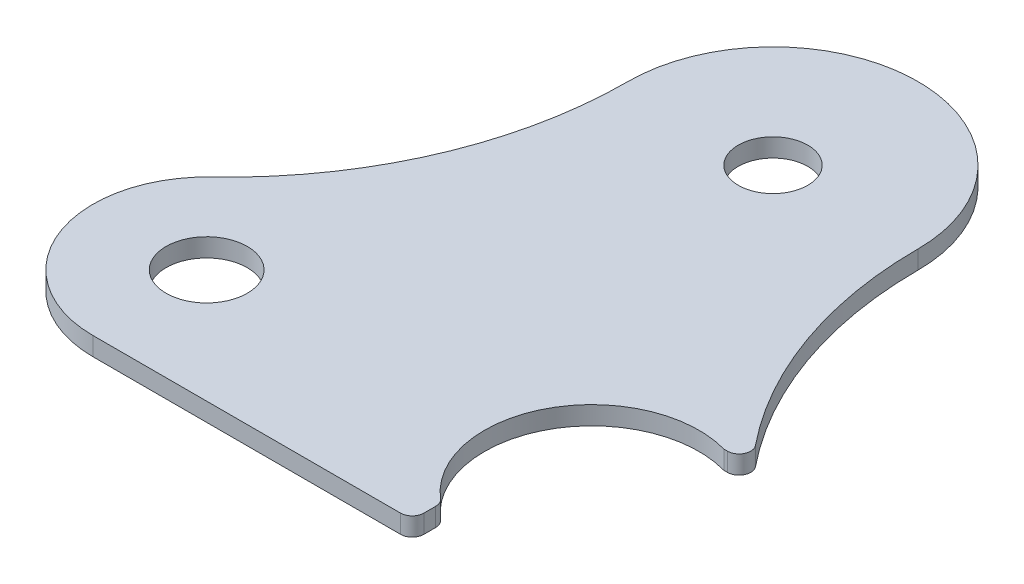
ISO-10303-21;
HEADER;
FILE_DESCRIPTION(('STEP AP214'),'2;1');
FILE_NAME('part.step','',(''),(''),'','','');
FILE_SCHEMA(('AUTOMOTIVE_DESIGN { 1 0 10303 214 1 1 1 1 }'));
ENDSEC;
DATA;
#1=APPLICATION_CONTEXT('core data for automotive mechanical design processes');
#2=APPLICATION_PROTOCOL_DEFINITION('international standard','automotive_design',2000,#1);
#3=PRODUCT_CONTEXT('',#1,'mechanical');
#4=PRODUCT('Part','Part','',(#3));
#5=PRODUCT_RELATED_PRODUCT_CATEGORY('part','',(#4));
#6=PRODUCT_DEFINITION_FORMATION('','',#4);
#7=PRODUCT_DEFINITION_CONTEXT('part definition',#1,'design');
#8=PRODUCT_DEFINITION('design','',#6,#7);
#9=PRODUCT_DEFINITION_SHAPE('','',#8);
#10=(LENGTH_UNIT() NAMED_UNIT(*) SI_UNIT(.MILLI.,.METRE.));
#11=(NAMED_UNIT(*) PLANE_ANGLE_UNIT() SI_UNIT($,.RADIAN.));
#12=(NAMED_UNIT(*) SI_UNIT($,.STERADIAN.) SOLID_ANGLE_UNIT());
#13=UNCERTAINTY_MEASURE_WITH_UNIT(LENGTH_MEASURE(1.E-05),#10,'distance_accuracy_value','');
#14=(GEOMETRIC_REPRESENTATION_CONTEXT(3) GLOBAL_UNCERTAINTY_ASSIGNED_CONTEXT((#13)) GLOBAL_UNIT_ASSIGNED_CONTEXT((#10,
#11,#12)) REPRESENTATION_CONTEXT('',''));
#15=CARTESIAN_POINT('',(0.,0.,0.));
#16=DIRECTION('',(0.,0.,1.));
#17=DIRECTION('',(1.,0.,0.));
#18=AXIS2_PLACEMENT_3D('',#15,#16,#17);
#19=CARTESIAN_POINT('',(0.,29.675,46.6220157262903));
#20=DIRECTION('',(0.,0.,-1.));
#21=DIRECTION('',(-1.,0.,0.));
#22=AXIS2_PLACEMENT_3D('',#19,#20,#21);
#23=PLANE('',#22);
#24=DIRECTION('',(1.,0.,0.));
#25=VECTOR('',#24,1.);
#26=CARTESIAN_POINT('',(0.,26.5,46.6220157262903));
#27=LINE('',#26,#25);
#28=CARTESIAN_POINT('',(38.1409489712363,26.5,46.6220157262903));
#29=VERTEX_POINT('',#28);
#30=CARTESIAN_POINT('',(38.7801844461986,26.5,46.6220157262903));
#31=VERTEX_POINT('',#30);
#32=EDGE_CURVE('E163',#29,#31,#27,.T.);
#33=ORIENTED_EDGE('',*,*,#32,.T.);
#34=DIRECTION('',(0.,-1.,0.));
#35=VECTOR('',#34,1.);
#36=CARTESIAN_POINT('',(38.7801844461986,29.675,46.6220157262903));
#37=LINE('',#36,#35);
#38=CARTESIAN_POINT('',(38.7801844461986,29.675,46.6220157262903));
#39=VERTEX_POINT('',#38);
#40=EDGE_CURVE('E11',#39,#31,#37,.T.);
#41=ORIENTED_EDGE('',*,*,#40,.F.);
#42=DIRECTION('',(1.,0.,0.));
#43=VECTOR('',#42,1.);
#44=CARTESIAN_POINT('',(0.,29.675,46.6220157262903));
#45=LINE('',#44,#43);
#46=CARTESIAN_POINT('',(38.1409489712363,29.675,46.6220157262903));
#47=VERTEX_POINT('',#46);
#48=EDGE_CURVE('E228',#47,#39,#45,.T.);
#49=ORIENTED_EDGE('',*,*,#48,.F.);
#50=DIRECTION('',(0.,-1.,0.));
#51=VECTOR('',#50,1.);
#52=CARTESIAN_POINT('',(38.1409489712363,29.675,46.6220157262903));
#53=LINE('',#52,#51);
#54=EDGE_CURVE('E58',#47,#29,#53,.T.);
#55=ORIENTED_EDGE('',*,*,#54,.T.);
#56=EDGE_LOOP('',(#33,#41,#49,#55));
#57=FACE_BOUND('',#56,.T.);
#58=ADVANCED_FACE('F41',(#57),#23,.F.);
#59=CARTESIAN_POINT('',(38.7801844461986,29.675,44.6220157262903));
#60=DIRECTION('',(0.,-1.,0.));
#61=DIRECTION('',(0.,0.,-1.));
#62=AXIS2_PLACEMENT_3D('',#59,#60,#61);
#63=CYLINDRICAL_SURFACE('',#62,2.);
#64=CARTESIAN_POINT('',(38.7801844461986,26.5,44.6220157262903));
#65=DIRECTION('',(0.,1.,0.));
#66=DIRECTION('',(0.,0.,1.));
#67=AXIS2_PLACEMENT_3D('',#64,#65,#66);
#68=CIRCLE('',#67,2.);
#69=CARTESIAN_POINT('',(40.3355436881448,26.5,43.3646941172767));
#70=VERTEX_POINT('',#69);
#71=EDGE_CURVE('E165',#31,#70,#68,.T.);
#72=ORIENTED_EDGE('',*,*,#71,.T.);
#73=DIRECTION('',(0.,-1.,0.));
#74=VECTOR('',#73,1.);
#75=CARTESIAN_POINT('',(40.3355436881448,29.675,43.3646941172767));
#76=LINE('',#75,#74);
#77=CARTESIAN_POINT('',(40.3355436881448,29.675,43.3646941172767));
#78=VERTEX_POINT('',#77);
#79=EDGE_CURVE('E50',#78,#70,#76,.T.);
#80=ORIENTED_EDGE('',*,*,#79,.F.);
#81=CARTESIAN_POINT('',(38.7801844461986,29.675,44.6220157262903));
#82=DIRECTION('',(0.,1.,0.));
#83=DIRECTION('',(0.,0.,1.));
#84=AXIS2_PLACEMENT_3D('',#81,#82,#83);
#85=CIRCLE('',#84,2.);
#86=EDGE_CURVE('E106',#39,#78,#85,.T.);
#87=ORIENTED_EDGE('',*,*,#86,.F.);
#88=ORIENTED_EDGE('',*,*,#40,.T.);
#89=EDGE_LOOP('',(#72,#80,#87,#88));
#90=FACE_BOUND('',#89,.T.);
#91=ADVANCED_FACE('F211',(#90),#63,.T.);
#92=CARTESIAN_POINT('',(93.9794779734972,29.675,0.));
#93=DIRECTION('',(0.,-1.,0.));
#94=DIRECTION('',(0.,0.,-1.));
#95=AXIS2_PLACEMENT_3D('',#92,#93,#94);
#96=CYLINDRICAL_SURFACE('',#95,68.9794779734972);
#97=CARTESIAN_POINT('',(93.9794779734972,26.5,0.));
#98=DIRECTION('',(0.,1.,0.));
#99=DIRECTION('',(0.,0.,1.));
#100=AXIS2_PLACEMENT_3D('',#97,#98,#99);
#101=CIRCLE('',#100,68.9794779734972);
#102=CARTESIAN_POINT('',(25.,26.5,0.));
#103=VERTEX_POINT('',#102);
#104=EDGE_CURVE('E168',#103,#70,#101,.T.);
#105=ORIENTED_EDGE('',*,*,#104,.F.);
#106=DIRECTION('',(0.,-1.,0.));
#107=VECTOR('',#106,1.);
#108=CARTESIAN_POINT('',(25.,29.675,0.));
#109=LINE('',#108,#107);
#110=CARTESIAN_POINT('',(25.,29.675,0.));
#111=VERTEX_POINT('',#110);
#112=EDGE_CURVE('E204',#111,#103,#109,.T.);
#113=ORIENTED_EDGE('',*,*,#112,.F.);
#114=CARTESIAN_POINT('',(93.9794779734972,29.675,0.));
#115=DIRECTION('',(0.,1.,0.));
#116=DIRECTION('',(0.,0.,1.));
#117=AXIS2_PLACEMENT_3D('',#114,#115,#116);
#118=CIRCLE('',#117,68.9794779734972);
#119=EDGE_CURVE('E210',#111,#78,#118,.T.);
#120=ORIENTED_EDGE('',*,*,#119,.T.);
#121=ORIENTED_EDGE('',*,*,#79,.T.);
#122=EDGE_LOOP('',(#105,#113,#120,#121));
#123=FACE_BOUND('',#122,.T.);
#124=ADVANCED_FACE('F208',(#123),#96,.F.);
#125=CARTESIAN_POINT('',(0.,29.675,0.));
#126=DIRECTION('',(0.,-1.,0.));
#127=DIRECTION('',(0.,0.,-1.));
#128=AXIS2_PLACEMENT_3D('',#125,#126,#127);
#129=CYLINDRICAL_SURFACE('',#128,25.);
#130=CARTESIAN_POINT('',(0.,26.5,0.));
#131=DIRECTION('',(0.,1.,0.));
#132=DIRECTION('',(0.,0.,1.));
#133=AXIS2_PLACEMENT_3D('',#130,#131,#132);
#134=CIRCLE('',#133,25.);
#135=CARTESIAN_POINT('',(-25.,26.5,0.));
#136=VERTEX_POINT('',#135);
#137=EDGE_CURVE('E171',#103,#136,#134,.T.);
#138=ORIENTED_EDGE('',*,*,#137,.T.);
#139=DIRECTION('',(0.,-1.,0.));
#140=VECTOR('',#139,1.);
#141=CARTESIAN_POINT('',(-25.,29.675,0.));
#142=LINE('',#141,#140);
#143=CARTESIAN_POINT('',(-25.,29.675,0.));
#144=VERTEX_POINT('',#143);
#145=EDGE_CURVE('E202',#144,#136,#142,.T.);
#146=ORIENTED_EDGE('',*,*,#145,.F.);
#147=CARTESIAN_POINT('',(0.,29.675,0.));
#148=DIRECTION('',(0.,1.,0.));
#149=DIRECTION('',(0.,0.,1.));
#150=AXIS2_PLACEMENT_3D('',#147,#148,#149);
#151=CIRCLE('',#150,25.);
#152=EDGE_CURVE('E223',#111,#144,#151,.T.);
#153=ORIENTED_EDGE('',*,*,#152,.F.);
#154=ORIENTED_EDGE('',*,*,#112,.T.);
#155=EDGE_LOOP('',(#138,#146,#153,#154));
#156=FACE_BOUND('',#155,.T.);
#157=ADVANCED_FACE('F220',(#156),#129,.T.);
#158=CARTESIAN_POINT('',(-93.9794779734972,29.675,0.));
#159=DIRECTION('',(0.,-1.,0.));
#160=DIRECTION('',(0.,0.,-1.));
#161=AXIS2_PLACEMENT_3D('',#158,#159,#160);
#162=CYLINDRICAL_SURFACE('',#161,68.9794779734972);
#163=CARTESIAN_POINT('',(-93.9794779734972,26.5,0.));
#164=DIRECTION('',(0.,1.,0.));
#165=DIRECTION('',(0.,0.,1.));
#166=AXIS2_PLACEMENT_3D('',#163,#164,#165);
#167=CIRCLE('',#166,68.9794779734972);
#168=CARTESIAN_POINT('',(-46.6535840387571,26.5,50.1839430971094));
#169=VERTEX_POINT('',#168);
#170=EDGE_CURVE('E174',#169,#136,#167,.T.);
#171=ORIENTED_EDGE('',*,*,#170,.F.);
#172=DIRECTION('',(0.,-1.,0.));
#173=VECTOR('',#172,1.);
#174=CARTESIAN_POINT('',(-46.6535840387571,29.675,50.1839430971094));
#175=LINE('',#174,#173);
#176=CARTESIAN_POINT('',(-46.6535840387571,29.675,50.1839430971094));
#177=VERTEX_POINT('',#176);
#178=EDGE_CURVE('E200',#177,#169,#175,.T.);
#179=ORIENTED_EDGE('',*,*,#178,.F.);
#180=CARTESIAN_POINT('',(-93.9794779734972,29.675,0.));
#181=DIRECTION('',(0.,1.,0.));
#182=DIRECTION('',(0.,0.,1.));
#183=AXIS2_PLACEMENT_3D('',#180,#181,#182);
#184=CIRCLE('',#183,68.9794779734972);
#185=EDGE_CURVE('E225',#177,#144,#184,.T.);
#186=ORIENTED_EDGE('',*,*,#185,.T.);
#187=ORIENTED_EDGE('',*,*,#145,.T.);
#188=EDGE_LOOP('',(#171,#179,#186,#187));
#189=FACE_BOUND('',#188,.T.);
#190=ADVANCED_FACE('F340',(#189),#162,.F.);
#191=CARTESIAN_POINT('',(-33.2,29.675,64.45));
#192=DIRECTION('',(0.,-1.,0.));
#193=DIRECTION('',(0.,0.,-1.));
#194=AXIS2_PLACEMENT_3D('',#191,#192,#193);
#195=CYLINDRICAL_SURFACE('',#194,19.6091637517874);
#196=CARTESIAN_POINT('',(-33.2,26.5,64.45));
#197=DIRECTION('',(0.,1.,0.));
#198=DIRECTION('',(0.,0.,1.));
#199=AXIS2_PLACEMENT_3D('',#196,#197,#198);
#200=CIRCLE('',#199,19.6091637517874);
#201=CARTESIAN_POINT('',(-33.2,26.5,84.0591637517874));
#202=VERTEX_POINT('',#201);
#203=EDGE_CURVE('E177',#169,#202,#200,.T.);
#204=ORIENTED_EDGE('',*,*,#203,.T.);
#205=DIRECTION('',(0.,-1.,0.));
#206=VECTOR('',#205,1.);
#207=CARTESIAN_POINT('',(-33.2,29.675,84.0591637517874));
#208=LINE('',#207,#206);
#209=CARTESIAN_POINT('',(-33.2,29.675,84.0591637517874));
#210=VERTEX_POINT('',#209);
#211=EDGE_CURVE('E198',#210,#202,#208,.T.);
#212=ORIENTED_EDGE('',*,*,#211,.F.);
#213=CARTESIAN_POINT('',(-33.2,29.675,64.45));
#214=DIRECTION('',(0.,1.,0.));
#215=DIRECTION('',(0.,0.,1.));
#216=AXIS2_PLACEMENT_3D('',#213,#214,#215);
#217=CIRCLE('',#216,19.6091637517874);
#218=EDGE_CURVE('E233',#177,#210,#217,.T.);
#219=ORIENTED_EDGE('',*,*,#218,.F.);
#220=ORIENTED_EDGE('',*,*,#178,.T.);
#221=EDGE_LOOP('',(#204,#212,#219,#220));
#222=FACE_BOUND('',#221,.T.);
#223=ADVANCED_FACE('F330',(#222),#195,.T.);
#224=CARTESIAN_POINT('',(0.,29.675,84.0591637517874));
#225=DIRECTION('',(0.,0.,1.));
#226=DIRECTION('',(1.,0.,0.));
#227=AXIS2_PLACEMENT_3D('',#224,#225,#226);
#228=PLANE('',#227);
#229=DIRECTION('',(-1.,0.,0.));
#230=VECTOR('',#229,1.);
#231=CARTESIAN_POINT('',(0.,26.5,84.0591637517874));
#232=LINE('',#231,#230);
#233=CARTESIAN_POINT('',(19.8500072919202,26.5,84.0591637517874));
#234=VERTEX_POINT('',#233);
#235=EDGE_CURVE('E180',#234,#202,#232,.T.);
#236=ORIENTED_EDGE('',*,*,#235,.F.);
#237=DIRECTION('',(0.,-1.,0.));
#238=VECTOR('',#237,1.);
#239=CARTESIAN_POINT('',(19.8500072919202,29.675,84.0591637517874));
#240=LINE('',#239,#238);
#241=CARTESIAN_POINT('',(19.8500072919202,29.675,84.0591637517874));
#242=VERTEX_POINT('',#241);
#243=EDGE_CURVE('E196',#242,#234,#240,.T.);
#244=ORIENTED_EDGE('',*,*,#243,.F.);
#245=DIRECTION('',(-1.,0.,0.));
#246=VECTOR('',#245,1.);
#247=CARTESIAN_POINT('',(0.,29.675,84.0591637517874));
#248=LINE('',#247,#246);
#249=EDGE_CURVE('E235',#242,#210,#248,.T.);
#250=ORIENTED_EDGE('',*,*,#249,.T.);
#251=ORIENTED_EDGE('',*,*,#211,.T.);
#252=EDGE_LOOP('',(#236,#244,#250,#251));
#253=FACE_BOUND('',#252,.T.);
#254=ADVANCED_FACE('F321',(#253),#228,.T.);
#255=CARTESIAN_POINT('',(19.8500072919202,29.675,82.0591637517874));
#256=DIRECTION('',(0.,-1.,0.));
#257=DIRECTION('',(0.,0.,-1.));
#258=AXIS2_PLACEMENT_3D('',#255,#256,#257);
#259=CYLINDRICAL_SURFACE('',#258,2.);
#260=CARTESIAN_POINT('',(19.8500072919202,26.5,82.0591637517874));
#261=DIRECTION('',(0.,1.,0.));
#262=DIRECTION('',(0.,0.,1.));
#263=AXIS2_PLACEMENT_3D('',#260,#261,#262);
#264=CIRCLE('',#263,2.);
#265=CARTESIAN_POINT('',(21.8500072919202,26.5,82.0591637517874));
#266=VERTEX_POINT('',#265);
#267=EDGE_CURVE('E183',#266,#234,#264,.F.);
#268=ORIENTED_EDGE('',*,*,#267,.F.);
#269=DIRECTION('',(0.,-1.,0.));
#270=VECTOR('',#269,1.);
#271=CARTESIAN_POINT('',(21.8500072919202,29.675,82.0591637517874));
#272=LINE('',#271,#270);
#273=CARTESIAN_POINT('',(21.8500072919202,29.675,82.0591637517874));
#274=VERTEX_POINT('',#273);
#275=EDGE_CURVE('E149',#274,#266,#272,.T.);
#276=ORIENTED_EDGE('',*,*,#275,.F.);
#277=CARTESIAN_POINT('',(19.8500072919202,29.675,82.0591637517874));
#278=DIRECTION('',(0.,1.,0.));
#279=DIRECTION('',(0.,0.,1.));
#280=AXIS2_PLACEMENT_3D('',#277,#278,#279);
#281=CIRCLE('',#280,2.);
#282=EDGE_CURVE('E139',#274,#242,#281,.F.);
#283=ORIENTED_EDGE('',*,*,#282,.T.);
#284=ORIENTED_EDGE('',*,*,#243,.T.);
#285=EDGE_LOOP('',(#268,#276,#283,#284));
#286=FACE_BOUND('',#285,.T.);
#287=ADVANCED_FACE('F239',(#286),#259,.T.);
#288=CARTESIAN_POINT('',(21.8500072919204,29.675,0.));
#289=DIRECTION('',(-1.,0.,0.));
#290=DIRECTION('',(0.,0.,1.));
#291=AXIS2_PLACEMENT_3D('',#288,#289,#290);
#292=PLANE('',#291);
#293=DIRECTION('',(0.,0.,-1.));
#294=VECTOR('',#293,1.);
#295=CARTESIAN_POINT('',(21.8500072919204,26.5,0.));
#296=LINE('',#295,#294);
#297=CARTESIAN_POINT('',(21.8500072919202,26.5,80.0072393018241));
#298=VERTEX_POINT('',#297);
#299=EDGE_CURVE('E146',#266,#298,#296,.T.);
#300=ORIENTED_EDGE('',*,*,#299,.T.);
#301=DIRECTION('',(0.,-1.,0.));
#302=VECTOR('',#301,1.);
#303=CARTESIAN_POINT('',(21.8500072919202,29.675,80.0072393018241));
#304=LINE('',#303,#302);
#305=CARTESIAN_POINT('',(21.8500072919202,29.675,80.0072393018241));
#306=VERTEX_POINT('',#305);
#307=EDGE_CURVE('E143',#306,#298,#304,.T.);
#308=ORIENTED_EDGE('',*,*,#307,.F.);
#309=DIRECTION('',(0.,0.,-1.));
#310=VECTOR('',#309,1.);
#311=CARTESIAN_POINT('',(21.8500072919204,29.675,0.));
#312=LINE('',#311,#310);
#313=EDGE_CURVE('E131',#274,#306,#312,.T.);
#314=ORIENTED_EDGE('',*,*,#313,.F.);
#315=ORIENTED_EDGE('',*,*,#275,.T.);
#316=EDGE_LOOP('',(#300,#308,#314,#315));
#317=FACE_BOUND('',#316,.T.);
#318=ADVANCED_FACE('F144',(#317),#292,.F.);
#319=CARTESIAN_POINT('',(19.8500072919202,29.675,80.0072393018241));
#320=DIRECTION('',(0.,-1.,0.));
#321=DIRECTION('',(0.,0.,-1.));
#322=AXIS2_PLACEMENT_3D('',#319,#320,#321);
#323=CYLINDRICAL_SURFACE('',#322,2.);
#324=CARTESIAN_POINT('',(19.8500072919202,26.5,80.0072393018241));
#325=DIRECTION('',(0.,1.,0.));
#326=DIRECTION('',(0.,0.,1.));
#327=AXIS2_PLACEMENT_3D('',#324,#325,#326);
#328=CIRCLE('',#327,2.);
#329=CARTESIAN_POINT('',(21.1524456049036,26.5,78.4894598577437));
#330=VERTEX_POINT('',#329);
#331=EDGE_CURVE('E187',#298,#330,#328,.T.);
#332=ORIENTED_EDGE('',*,*,#331,.T.);
#333=DIRECTION('',(0.,-1.,0.));
#334=VECTOR('',#333,1.);
#335=CARTESIAN_POINT('',(21.1524456049036,29.675,78.4894598577437));
#336=LINE('',#335,#334);
#337=CARTESIAN_POINT('',(21.1524456049036,29.675,78.4894598577437));
#338=VERTEX_POINT('',#337);
#339=EDGE_CURVE('E94',#338,#330,#336,.T.);
#340=ORIENTED_EDGE('',*,*,#339,.F.);
#341=CARTESIAN_POINT('',(19.8500072919202,29.675,80.0072393018241));
#342=DIRECTION('',(0.,1.,0.));
#343=DIRECTION('',(0.,0.,1.));
#344=AXIS2_PLACEMENT_3D('',#341,#342,#343);
#345=CIRCLE('',#344,2.);
#346=EDGE_CURVE('E136',#306,#338,#345,.T.);
#347=ORIENTED_EDGE('',*,*,#346,.F.);
#348=ORIENTED_EDGE('',*,*,#307,.T.);
#349=EDGE_LOOP('',(#332,#340,#347,#348));
#350=FACE_BOUND('',#349,.T.);
#351=ADVANCED_FACE('F151',(#350),#323,.T.);
#352=CARTESIAN_POINT('',(-33.2,29.675,64.45));
#353=DIRECTION('',(0.,-1.,0.));
#354=DIRECTION('',(0.,0.,-1.));
#355=AXIS2_PLACEMENT_3D('',#352,#353,#354);
#356=CYLINDRICAL_SURFACE('',#355,7.);
#357=CARTESIAN_POINT('',(-33.2,29.675,64.45));
#358=DIRECTION('',(0.,1.,0.));
#359=DIRECTION('',(0.,0.,1.));
#360=AXIS2_PLACEMENT_3D('',#357,#358,#359);
#361=CIRCLE('',#360,7.);
#362=CARTESIAN_POINT('',(-33.2,29.675,57.45));
#363=VERTEX_POINT('',#362);
#364=EDGE_CURVE('E269',#363,#363,#361,.T.);
#365=CARTESIAN_POINT('',(-33.2,26.5,64.45));
#366=DIRECTION('',(0.,1.,0.));
#367=DIRECTION('',(0.,0.,1.));
#368=AXIS2_PLACEMENT_3D('',#365,#366,#367);
#369=CIRCLE('',#368,7.);
#370=CARTESIAN_POINT('',(-33.2,26.5,57.45));
#371=VERTEX_POINT('',#370);
#372=EDGE_CURVE('E160',#371,#371,#369,.T.);
#373=CARTESIAN_POINT('',(-33.2,29.675,57.45));
#374=CARTESIAN_POINT('',(-33.2,29.6419270833333,57.45));
#375=CARTESIAN_POINT('',(-33.2,29.6088541666667,57.45));
#376=CARTESIAN_POINT('',(-33.2,29.5427083333333,57.45));
#377=CARTESIAN_POINT('',(-33.2,29.5096354166667,57.45));
#378=CARTESIAN_POINT('',(-33.2,29.4434895833333,57.45));
#379=CARTESIAN_POINT('',(-33.2,29.4104166666667,57.45));
#380=CARTESIAN_POINT('',(-33.2,29.3442708333333,57.45));
#381=CARTESIAN_POINT('',(-33.2,29.3111979166667,57.45));
#382=CARTESIAN_POINT('',(-33.2,29.2450520833333,57.45));
#383=CARTESIAN_POINT('',(-33.2,29.2119791666666,57.45));
#384=CARTESIAN_POINT('',(-33.2,29.1458333333333,57.45));
#385=CARTESIAN_POINT('',(-33.2,29.1127604166666,57.45));
#386=CARTESIAN_POINT('',(-33.2,29.0466145833333,57.45));
#387=CARTESIAN_POINT('',(-33.2,29.0135416666667,57.45));
#388=CARTESIAN_POINT('',(-33.2,28.9473958333333,57.45));
#389=CARTESIAN_POINT('',(-33.2,28.9143229166666,57.45));
#390=CARTESIAN_POINT('',(-33.2,28.8481770833333,57.45));
#391=CARTESIAN_POINT('',(-33.2,28.8151041666666,57.45));
#392=CARTESIAN_POINT('',(-33.2,28.7489583333333,57.45));
#393=CARTESIAN_POINT('',(-33.2,28.7158854166666,57.45));
#394=CARTESIAN_POINT('',(-33.2,28.6497395833333,57.45));
#395=CARTESIAN_POINT('',(-33.2,28.6166666666666,57.45));
#396=CARTESIAN_POINT('',(-33.2,28.5505208333333,57.45));
#397=CARTESIAN_POINT('',(-33.2,28.5174479166666,57.45));
#398=CARTESIAN_POINT('',(-33.2,28.4513020833333,57.45));
#399=CARTESIAN_POINT('',(-33.2,28.4182291666666,57.45));
#400=CARTESIAN_POINT('',(-33.2,28.3520833333333,57.45));
#401=CARTESIAN_POINT('',(-33.2,28.3190104166666,57.45));
#402=CARTESIAN_POINT('',(-33.2,28.2528645833333,57.45));
#403=CARTESIAN_POINT('',(-33.2,28.2197916666666,57.45));
#404=CARTESIAN_POINT('',(-33.2,28.1536458333333,57.45));
#405=CARTESIAN_POINT('',(-33.2,28.1205729166666,57.45));
#406=CARTESIAN_POINT('',(-33.2,28.0544270833333,57.45));
#407=CARTESIAN_POINT('',(-33.2,28.0213541666666,57.45));
#408=CARTESIAN_POINT('',(-33.2,27.9552083333333,57.45));
#409=CARTESIAN_POINT('',(-33.2,27.9221354166666,57.45));
#410=CARTESIAN_POINT('',(-33.2,27.8559895833333,57.45));
#411=CARTESIAN_POINT('',(-33.2,27.8229166666666,57.45));
#412=CARTESIAN_POINT('',(-33.2,27.7567708333333,57.45));
#413=CARTESIAN_POINT('',(-33.2,27.7236979166666,57.45));
#414=CARTESIAN_POINT('',(-33.2,27.6575520833333,57.45));
#415=CARTESIAN_POINT('',(-33.2,27.6244791666666,57.45));
#416=CARTESIAN_POINT('',(-33.2,27.5583333333333,57.45));
#417=CARTESIAN_POINT('',(-33.2,27.5252604166666,57.45));
#418=CARTESIAN_POINT('',(-33.2,27.4591145833333,57.45));
#419=CARTESIAN_POINT('',(-33.2,27.4260416666666,57.45));
#420=CARTESIAN_POINT('',(-33.2,27.3598958333333,57.45));
#421=CARTESIAN_POINT('',(-33.2,27.3268229166666,57.45));
#422=CARTESIAN_POINT('',(-33.2,27.2606770833333,57.45));
#423=CARTESIAN_POINT('',(-33.2,27.2276041666666,57.45));
#424=CARTESIAN_POINT('',(-33.2,27.1614583333333,57.45));
#425=CARTESIAN_POINT('',(-33.2,27.1283854166666,57.45));
#426=CARTESIAN_POINT('',(-33.2,27.0622395833333,57.45));
#427=CARTESIAN_POINT('',(-33.2,27.0291666666666,57.45));
#428=CARTESIAN_POINT('',(-33.2,26.9630208333333,57.45));
#429=CARTESIAN_POINT('',(-33.2,26.9299479166666,57.45));
#430=CARTESIAN_POINT('',(-33.2,26.8638020833333,57.45));
#431=CARTESIAN_POINT('',(-33.2,26.8307291666666,57.45));
#432=CARTESIAN_POINT('',(-33.2,26.7645833333333,57.45));
#433=CARTESIAN_POINT('',(-33.2,26.7315104166666,57.45));
#434=CARTESIAN_POINT('',(-33.2,26.6653645833333,57.45));
#435=CARTESIAN_POINT('',(-33.2,26.6322916666666,57.45));
#436=CARTESIAN_POINT('',(-33.2,26.5661458333333,57.45));
#437=CARTESIAN_POINT('',(-33.2,26.5330729166666,57.45));
#438=CARTESIAN_POINT('',(-33.2,26.5,57.45));
#439=B_SPLINE_CURVE_WITH_KNOTS('',3,(#373,#374,#375,#376,#377,#378,#379,#380,#381,#382,#383,
#384,#385,#386,#387,#388,#389,#390,#391,#392,#393,#394,#395,#396,#397,#398,#399,#400,#401,#402,
#403,#404,#405,#406,#407,#408,#409,#410,#411,#412,#413,#414,#415,#416,#417,#418,#419,#420,#421,
#422,#423,#424,#425,#426,#427,#428,#429,#430,#431,#432,#433,#434,#435,#436,#437,#438),
.UNSPECIFIED.,.F.,.F.,(4,2,2,2,2,2,2,2,2,2,2,2,2,2,2,2,2,2,2,2,2,2,2,2,2,2,2,2,2,2,2,2,4),(0.,
0.0992187500000012,0.198437500000002,0.297656250000004,0.396875000000005,0.496093750000003,
0.595312500000004,0.694531250000005,0.793750000000006,0.892968750000007,0.992187500000005,
1.09140625000001,1.19062500000001,1.28984375000001,1.38906250000001,1.48828125000001,
1.58750000000001,1.68671875000001,1.78593750000001,1.88515625000001,1.98437500000001,
2.08359375000001,2.18281250000001,2.28203125000001,2.38125000000001,2.48046875000001,
2.57968750000001,2.67890625000002,2.77812500000001,2.87734375000001,2.97656250000002,
3.07578125000002,3.17500000000001),.UNSPECIFIED.);
#440=EDGE_CURVE('BSEAM250',#363,#371,#439,.T.);
#441=ORIENTED_EDGE('',*,*,#364,.T.);
#442=ORIENTED_EDGE('',*,*,#372,.F.);
#443=ORIENTED_EDGE('',*,*,#440,.T.);
#444=ORIENTED_EDGE('',*,*,#440,.F.);
#445=EDGE_LOOP('',(#441,#443,#442,#444));
#446=FACE_BOUND('',#445,.T.);
#447=ADVANCED_FACE('F250',(#446),#356,.F.);
#448=CARTESIAN_POINT('',(0.,29.675,0.));
#449=DIRECTION('',(0.,-1.,0.));
#450=DIRECTION('',(0.,0.,-1.));
#451=AXIS2_PLACEMENT_3D('',#448,#449,#450);
#452=CYLINDRICAL_SURFACE('',#451,6.00000000000002);
#453=CARTESIAN_POINT('',(0.,29.675,0.));
#454=DIRECTION('',(0.,1.,0.));
#455=DIRECTION('',(0.,0.,1.));
#456=AXIS2_PLACEMENT_3D('',#453,#454,#455);
#457=CIRCLE('',#456,6.00000000000002);
#458=CARTESIAN_POINT('',(0.,29.675,-6.00000000000002));
#459=VERTEX_POINT('',#458);
#460=EDGE_CURVE('E192',#459,#459,#457,.T.);
#461=CARTESIAN_POINT('',(0.,26.5,0.));
#462=DIRECTION('',(0.,1.,0.));
#463=DIRECTION('',(0.,0.,1.));
#464=AXIS2_PLACEMENT_3D('',#461,#462,#463);
#465=CIRCLE('',#464,6.00000000000002);
#466=CARTESIAN_POINT('',(0.,26.5,-6.00000000000002));
#467=VERTEX_POINT('',#466);
#468=EDGE_CURVE('E157',#467,#467,#465,.T.);
#469=CARTESIAN_POINT('',(0.,29.675,-6.00000000000002));
#470=CARTESIAN_POINT('',(0.,29.6419270833333,-6.00000000000002));
#471=CARTESIAN_POINT('',(0.,29.6088541666667,-6.00000000000002));
#472=CARTESIAN_POINT('',(0.,29.5427083333333,-6.00000000000002));
#473=CARTESIAN_POINT('',(0.,29.5096354166667,-6.00000000000002));
#474=CARTESIAN_POINT('',(0.,29.4434895833333,-6.00000000000002));
#475=CARTESIAN_POINT('',(0.,29.4104166666667,-6.00000000000002));
#476=CARTESIAN_POINT('',(0.,29.3442708333333,-6.00000000000002));
#477=CARTESIAN_POINT('',(0.,29.3111979166667,-6.00000000000002));
#478=CARTESIAN_POINT('',(0.,29.2450520833333,-6.00000000000002));
#479=CARTESIAN_POINT('',(0.,29.2119791666666,-6.00000000000002));
#480=CARTESIAN_POINT('',(0.,29.1458333333333,-6.00000000000002));
#481=CARTESIAN_POINT('',(0.,29.1127604166666,-6.00000000000002));
#482=CARTESIAN_POINT('',(0.,29.0466145833333,-6.00000000000002));
#483=CARTESIAN_POINT('',(0.,29.0135416666667,-6.00000000000002));
#484=CARTESIAN_POINT('',(0.,28.9473958333333,-6.00000000000002));
#485=CARTESIAN_POINT('',(0.,28.9143229166666,-6.00000000000002));
#486=CARTESIAN_POINT('',(0.,28.8481770833333,-6.00000000000002));
#487=CARTESIAN_POINT('',(0.,28.8151041666666,-6.00000000000002));
#488=CARTESIAN_POINT('',(0.,28.7489583333333,-6.00000000000002));
#489=CARTESIAN_POINT('',(0.,28.7158854166666,-6.00000000000002));
#490=CARTESIAN_POINT('',(0.,28.6497395833333,-6.00000000000002));
#491=CARTESIAN_POINT('',(0.,28.6166666666666,-6.00000000000002));
#492=CARTESIAN_POINT('',(0.,28.5505208333333,-6.00000000000002));
#493=CARTESIAN_POINT('',(0.,28.5174479166666,-6.00000000000002));
#494=CARTESIAN_POINT('',(0.,28.4513020833333,-6.00000000000002));
#495=CARTESIAN_POINT('',(0.,28.4182291666666,-6.00000000000002));
#496=CARTESIAN_POINT('',(0.,28.3520833333333,-6.00000000000002));
#497=CARTESIAN_POINT('',(0.,28.3190104166666,-6.00000000000002));
#498=CARTESIAN_POINT('',(0.,28.2528645833333,-6.00000000000002));
#499=CARTESIAN_POINT('',(0.,28.2197916666666,-6.00000000000002));
#500=CARTESIAN_POINT('',(0.,28.1536458333333,-6.00000000000002));
#501=CARTESIAN_POINT('',(0.,28.1205729166666,-6.00000000000002));
#502=CARTESIAN_POINT('',(0.,28.0544270833333,-6.00000000000002));
#503=CARTESIAN_POINT('',(0.,28.0213541666666,-6.00000000000002));
#504=CARTESIAN_POINT('',(0.,27.9552083333333,-6.00000000000002));
#505=CARTESIAN_POINT('',(0.,27.9221354166666,-6.00000000000002));
#506=CARTESIAN_POINT('',(0.,27.8559895833333,-6.00000000000002));
#507=CARTESIAN_POINT('',(0.,27.8229166666666,-6.00000000000002));
#508=CARTESIAN_POINT('',(0.,27.7567708333333,-6.00000000000002));
#509=CARTESIAN_POINT('',(0.,27.7236979166666,-6.00000000000002));
#510=CARTESIAN_POINT('',(0.,27.6575520833333,-6.00000000000002));
#511=CARTESIAN_POINT('',(0.,27.6244791666666,-6.00000000000002));
#512=CARTESIAN_POINT('',(0.,27.5583333333333,-6.00000000000002));
#513=CARTESIAN_POINT('',(0.,27.5252604166666,-6.00000000000002));
#514=CARTESIAN_POINT('',(0.,27.4591145833333,-6.00000000000002));
#515=CARTESIAN_POINT('',(0.,27.4260416666666,-6.00000000000002));
#516=CARTESIAN_POINT('',(0.,27.3598958333333,-6.00000000000002));
#517=CARTESIAN_POINT('',(0.,27.3268229166666,-6.00000000000002));
#518=CARTESIAN_POINT('',(0.,27.2606770833333,-6.00000000000002));
#519=CARTESIAN_POINT('',(0.,27.2276041666666,-6.00000000000002));
#520=CARTESIAN_POINT('',(0.,27.1614583333333,-6.00000000000002));
#521=CARTESIAN_POINT('',(0.,27.1283854166666,-6.00000000000002));
#522=CARTESIAN_POINT('',(0.,27.0622395833333,-6.00000000000002));
#523=CARTESIAN_POINT('',(0.,27.0291666666666,-6.00000000000002));
#524=CARTESIAN_POINT('',(0.,26.9630208333333,-6.00000000000002));
#525=CARTESIAN_POINT('',(0.,26.9299479166666,-6.00000000000002));
#526=CARTESIAN_POINT('',(0.,26.8638020833333,-6.00000000000002));
#527=CARTESIAN_POINT('',(0.,26.8307291666666,-6.00000000000002));
#528=CARTESIAN_POINT('',(0.,26.7645833333333,-6.00000000000002));
#529=CARTESIAN_POINT('',(0.,26.7315104166666,-6.00000000000002));
#530=CARTESIAN_POINT('',(0.,26.6653645833333,-6.00000000000002));
#531=CARTESIAN_POINT('',(0.,26.6322916666666,-6.00000000000002));
#532=CARTESIAN_POINT('',(0.,26.5661458333333,-6.00000000000002));
#533=CARTESIAN_POINT('',(0.,26.5330729166666,-6.00000000000002));
#534=CARTESIAN_POINT('',(0.,26.5,-6.00000000000002));
#535=B_SPLINE_CURVE_WITH_KNOTS('',3,(#469,#470,#471,#472,#473,#474,#475,#476,#477,#478,#479,
#480,#481,#482,#483,#484,#485,#486,#487,#488,#489,#490,#491,#492,#493,#494,#495,#496,#497,#498,
#499,#500,#501,#502,#503,#504,#505,#506,#507,#508,#509,#510,#511,#512,#513,#514,#515,#516,#517,
#518,#519,#520,#521,#522,#523,#524,#525,#526,#527,#528,#529,#530,#531,#532,#533,#534),
.UNSPECIFIED.,.F.,.F.,(4,2,2,2,2,2,2,2,2,2,2,2,2,2,2,2,2,2,2,2,2,2,2,2,2,2,2,2,2,2,2,2,4),(0.,
0.0992187500000012,0.198437500000002,0.297656250000004,0.396875000000005,0.496093750000003,
0.595312500000004,0.694531250000005,0.793750000000006,0.892968750000007,0.992187500000005,
1.09140625000001,1.19062500000001,1.28984375000001,1.38906250000001,1.48828125000001,
1.58750000000001,1.68671875000001,1.78593750000001,1.88515625000001,1.98437500000001,
2.08359375000001,2.18281250000001,2.28203125000001,2.38125000000001,2.48046875000001,
2.57968750000001,2.67890625000002,2.77812500000001,2.87734375000001,2.97656250000002,
3.07578125000002,3.17500000000001),.UNSPECIFIED.);
#536=EDGE_CURVE('BSEAM43',#459,#467,#535,.T.);
#537=ORIENTED_EDGE('',*,*,#460,.T.);
#538=ORIENTED_EDGE('',*,*,#468,.F.);
#539=ORIENTED_EDGE('',*,*,#536,.T.);
#540=ORIENTED_EDGE('',*,*,#536,.F.);
#541=EDGE_LOOP('',(#537,#539,#538,#540));
#542=FACE_BOUND('',#541,.T.);
#543=ADVANCED_FACE('F43',(#542),#452,.F.);
#544=CARTESIAN_POINT('',(33.2,29.675,64.45));
#545=DIRECTION('',(0.,-1.,0.));
#546=DIRECTION('',(0.,0.,-1.));
#547=AXIS2_PLACEMENT_3D('',#544,#545,#546);
#548=CYLINDRICAL_SURFACE('',#547,18.5);
#549=CARTESIAN_POINT('',(33.2,26.5,64.45));
#550=DIRECTION('',(0.,1.,0.));
#551=DIRECTION('',(0.,0.,1.));
#552=AXIS2_PLACEMENT_3D('',#549,#550,#551);
#553=CIRCLE('',#552,18.5);
#554=EDGE_CURVE('E189',#29,#330,#553,.T.);
#555=ORIENTED_EDGE('',*,*,#554,.F.);
#556=ORIENTED_EDGE('',*,*,#54,.F.);
#557=CARTESIAN_POINT('',(33.2,29.675,64.45));
#558=DIRECTION('',(0.,1.,0.));
#559=DIRECTION('',(0.,0.,1.));
#560=AXIS2_PLACEMENT_3D('',#557,#558,#559);
#561=CIRCLE('',#560,18.5);
#562=EDGE_CURVE('E152',#47,#338,#561,.T.);
#563=ORIENTED_EDGE('',*,*,#562,.T.);
#564=ORIENTED_EDGE('',*,*,#339,.T.);
#565=EDGE_LOOP('',(#555,#556,#563,#564));
#566=FACE_BOUND('',#565,.T.);
#567=ADVANCED_FACE('F241',(#566),#548,.F.);
#568=CARTESIAN_POINT('',(0.,29.675,0.));
#569=DIRECTION('',(0.,1.,0.));
#570=DIRECTION('',(0.,0.,1.));
#571=AXIS2_PLACEMENT_3D('',#568,#569,#570);
#572=PLANE('',#571);
#573=ORIENTED_EDGE('',*,*,#460,.F.);
#574=EDGE_LOOP('',(#573));
#575=FACE_BOUND('',#574,.T.);
#576=ORIENTED_EDGE('',*,*,#364,.F.);
#577=EDGE_LOOP('',(#576));
#578=FACE_BOUND('',#577,.T.);
#579=ORIENTED_EDGE('',*,*,#48,.T.);
#580=ORIENTED_EDGE('',*,*,#86,.T.);
#581=ORIENTED_EDGE('',*,*,#119,.F.);
#582=ORIENTED_EDGE('',*,*,#152,.T.);
#583=ORIENTED_EDGE('',*,*,#185,.F.);
#584=ORIENTED_EDGE('',*,*,#218,.T.);
#585=ORIENTED_EDGE('',*,*,#249,.F.);
#586=ORIENTED_EDGE('',*,*,#282,.F.);
#587=ORIENTED_EDGE('',*,*,#313,.T.);
#588=ORIENTED_EDGE('',*,*,#346,.T.);
#589=ORIENTED_EDGE('',*,*,#562,.F.);
#590=EDGE_LOOP('',(#579,#580,#581,#582,#583,#584,#585,#586,#587,#588,#589));
#591=FACE_BOUND('',#590,.T.);
#592=ADVANCED_FACE('F133',(#575,#578,#591),#572,.T.);
#593=CARTESIAN_POINT('',(0.,26.5,0.));
#594=DIRECTION('',(0.,1.,0.));
#595=DIRECTION('',(0.,0.,1.));
#596=AXIS2_PLACEMENT_3D('',#593,#594,#595);
#597=PLANE('',#596);
#598=ORIENTED_EDGE('',*,*,#468,.T.);
#599=EDGE_LOOP('',(#598));
#600=FACE_BOUND('',#599,.T.);
#601=ORIENTED_EDGE('',*,*,#372,.T.);
#602=EDGE_LOOP('',(#601));
#603=FACE_BOUND('',#602,.T.);
#604=ORIENTED_EDGE('',*,*,#32,.F.);
#605=ORIENTED_EDGE('',*,*,#554,.T.);
#606=ORIENTED_EDGE('',*,*,#331,.F.);
#607=ORIENTED_EDGE('',*,*,#299,.F.);
#608=ORIENTED_EDGE('',*,*,#267,.T.);
#609=ORIENTED_EDGE('',*,*,#235,.T.);
#610=ORIENTED_EDGE('',*,*,#203,.F.);
#611=ORIENTED_EDGE('',*,*,#170,.T.);
#612=ORIENTED_EDGE('',*,*,#137,.F.);
#613=ORIENTED_EDGE('',*,*,#104,.T.);
#614=ORIENTED_EDGE('',*,*,#71,.F.);
#615=EDGE_LOOP('',(#604,#605,#606,#607,#608,#609,#610,#611,#612,#613,#614));
#616=FACE_BOUND('',#615,.T.);
#617=ADVANCED_FACE('F215',(#600,#603,#616),#597,.F.);
#618=CLOSED_SHELL('',(#58,#91,#124,#157,#190,#223,#254,#287,#318,#351,#447,#543,#567,#592,#617));
#619=MANIFOLD_SOLID_BREP('B2',#618);
#620=ADVANCED_BREP_SHAPE_REPRESENTATION('',(#18,#619),#14);
#621=SHAPE_DEFINITION_REPRESENTATION(#9,#620);
ENDSEC;
END-ISO-10303-21;
